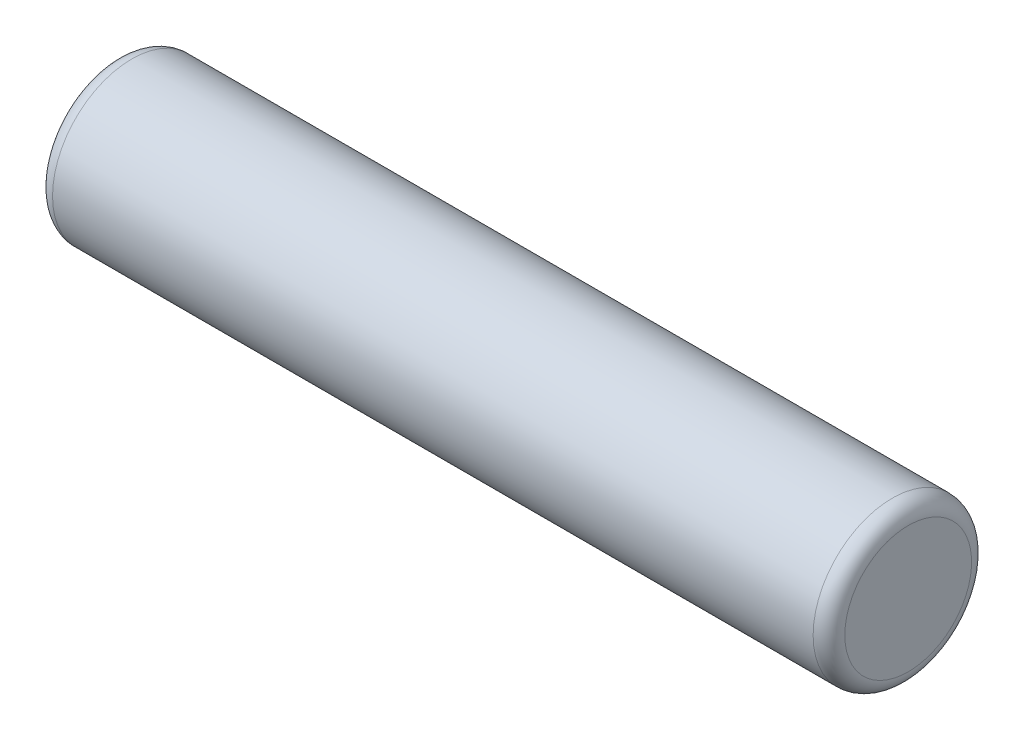
ISO-10303-21;
HEADER;
FILE_DESCRIPTION(('STEP AP214'),'2;1');
FILE_NAME('part.step','',(''),(''),'','','');
FILE_SCHEMA(('AUTOMOTIVE_DESIGN { 1 0 10303 214 1 1 1 1 }'));
ENDSEC;
DATA;
#1=APPLICATION_CONTEXT('core data for automotive mechanical design processes');
#2=APPLICATION_PROTOCOL_DEFINITION('international standard','automotive_design',2000,#1);
#3=PRODUCT_CONTEXT('',#1,'mechanical');
#4=PRODUCT('Part','Part','',(#3));
#5=PRODUCT_RELATED_PRODUCT_CATEGORY('part','',(#4));
#6=PRODUCT_DEFINITION_FORMATION('','',#4);
#7=PRODUCT_DEFINITION_CONTEXT('part definition',#1,'design');
#8=PRODUCT_DEFINITION('design','',#6,#7);
#9=PRODUCT_DEFINITION_SHAPE('','',#8);
#10=(LENGTH_UNIT() NAMED_UNIT(*) SI_UNIT(.MILLI.,.METRE.));
#11=(NAMED_UNIT(*) PLANE_ANGLE_UNIT() SI_UNIT($,.RADIAN.));
#12=(NAMED_UNIT(*) SI_UNIT($,.STERADIAN.) SOLID_ANGLE_UNIT());
#13=UNCERTAINTY_MEASURE_WITH_UNIT(LENGTH_MEASURE(1.E-05),#10,'distance_accuracy_value','');
#14=(GEOMETRIC_REPRESENTATION_CONTEXT(3) GLOBAL_UNCERTAINTY_ASSIGNED_CONTEXT((#13)) GLOBAL_UNIT_ASSIGNED_CONTEXT((#10,
#11,#12)) REPRESENTATION_CONTEXT('',''));
#15=CARTESIAN_POINT('',(0.,0.,0.));
#16=DIRECTION('',(0.,0.,1.));
#17=DIRECTION('',(1.,0.,0.));
#18=AXIS2_PLACEMENT_3D('',#15,#16,#17);
#19=CARTESIAN_POINT('',(0.,0.,0.));
#20=DIRECTION('',(1.,0.,0.));
#21=DIRECTION('',(0.,0.,-1.));
#22=AXIS2_PLACEMENT_3D('',#19,#20,#21);
#23=PLANE('',#22);
#24=CARTESIAN_POINT('',(0.,0.,0.));
#25=DIRECTION('',(1.,0.,0.));
#26=DIRECTION('',(0.,0.,-1.));
#27=AXIS2_PLACEMENT_3D('',#24,#25,#26);
#28=CIRCLE('',#27,4.);
#29=CARTESIAN_POINT('',(0.,0.,-4.));
#30=VERTEX_POINT('',#29);
#31=EDGE_CURVE('E10',#30,#30,#28,.F.);
#32=ORIENTED_EDGE('',*,*,#31,.T.);
#33=EDGE_LOOP('',(#32));
#34=FACE_BOUND('',#33,.T.);
#35=ADVANCED_FACE('F36',(#34),#23,.F.);
#36=CARTESIAN_POINT('',(0.,0.,0.));
#37=DIRECTION('',(-1.,0.,0.));
#38=DIRECTION('',(0.,0.,1.));
#39=AXIS2_PLACEMENT_3D('',#36,#37,#38);
#40=CYLINDRICAL_SURFACE('',#39,5.);
#41=CARTESIAN_POINT('',(49.,0.,0.));
#42=DIRECTION('',(-1.,0.,0.));
#43=DIRECTION('',(0.,0.,1.));
#44=AXIS2_PLACEMENT_3D('',#41,#42,#43);
#45=CIRCLE('',#44,5.);
#46=CARTESIAN_POINT('',(49.,0.,5.));
#47=VERTEX_POINT('',#46);
#48=EDGE_CURVE('E47',#47,#47,#45,.T.);
#49=ORIENTED_EDGE('',*,*,#48,.T.);
#50=EDGE_LOOP('',(#49));
#51=FACE_BOUND('',#50,.T.);
#52=CARTESIAN_POINT('',(1.,0.,0.));
#53=DIRECTION('',(1.,0.,0.));
#54=DIRECTION('',(0.,0.,-1.));
#55=AXIS2_PLACEMENT_3D('',#52,#53,#54);
#56=CIRCLE('',#55,5.);
#57=CARTESIAN_POINT('',(1.,0.,-5.));
#58=VERTEX_POINT('',#57);
#59=EDGE_CURVE('E51',#58,#58,#56,.T.);
#60=ORIENTED_EDGE('',*,*,#59,.T.);
#61=EDGE_LOOP('',(#60));
#62=FACE_BOUND('',#61,.T.);
#63=ADVANCED_FACE('F57',(#51,#62),#40,.T.);
#64=CARTESIAN_POINT('',(50.,0.,0.));
#65=DIRECTION('',(-1.,0.,0.));
#66=DIRECTION('',(0.,0.,1.));
#67=AXIS2_PLACEMENT_3D('',#64,#65,#66);
#68=PLANE('',#67);
#69=CARTESIAN_POINT('',(50.,0.,0.));
#70=DIRECTION('',(-1.,0.,0.));
#71=DIRECTION('',(0.,0.,1.));
#72=AXIS2_PLACEMENT_3D('',#69,#70,#71);
#73=CIRCLE('',#72,4.);
#74=CARTESIAN_POINT('',(50.,0.,4.));
#75=VERTEX_POINT('',#74);
#76=EDGE_CURVE('E43',#75,#75,#73,.F.);
#77=ORIENTED_EDGE('',*,*,#76,.T.);
#78=EDGE_LOOP('',(#77));
#79=FACE_BOUND('',#78,.T.);
#80=ADVANCED_FACE('F65',(#79),#68,.F.);
#81=CARTESIAN_POINT('',(49.,0.,0.));
#82=DIRECTION('',(-1.,0.,0.));
#83=DIRECTION('',(0.,0.,1.));
#84=AXIS2_PLACEMENT_3D('',#81,#82,#83);
#85=TOROIDAL_SURFACE('',#84,4.,1.);
#86=ORIENTED_EDGE('',*,*,#76,.F.);
#87=EDGE_LOOP('',(#86));
#88=FACE_BOUND('',#87,.T.);
#89=ORIENTED_EDGE('',*,*,#48,.F.);
#90=EDGE_LOOP('',(#89));
#91=FACE_BOUND('',#90,.T.);
#92=ADVANCED_FACE('F61',(#88,#91),#85,.T.);
#93=CARTESIAN_POINT('',(1.,0.,0.));
#94=DIRECTION('',(1.,0.,0.));
#95=DIRECTION('',(0.,0.,-1.));
#96=AXIS2_PLACEMENT_3D('',#93,#94,#95);
#97=TOROIDAL_SURFACE('',#96,4.,1.);
#98=ORIENTED_EDGE('',*,*,#59,.F.);
#99=EDGE_LOOP('',(#98));
#100=FACE_BOUND('',#99,.T.);
#101=ORIENTED_EDGE('',*,*,#31,.F.);
#102=EDGE_LOOP('',(#101));
#103=FACE_BOUND('',#102,.T.);
#104=ADVANCED_FACE('F38',(#100,#103),#97,.T.);
#105=CLOSED_SHELL('',(#35,#63,#80,#92,#104));
#106=MANIFOLD_SOLID_BREP('B2',#105);
#107=ADVANCED_BREP_SHAPE_REPRESENTATION('',(#18,#106),#14);
#108=SHAPE_DEFINITION_REPRESENTATION(#9,#107);
ENDSEC;
END-ISO-10303-21;
